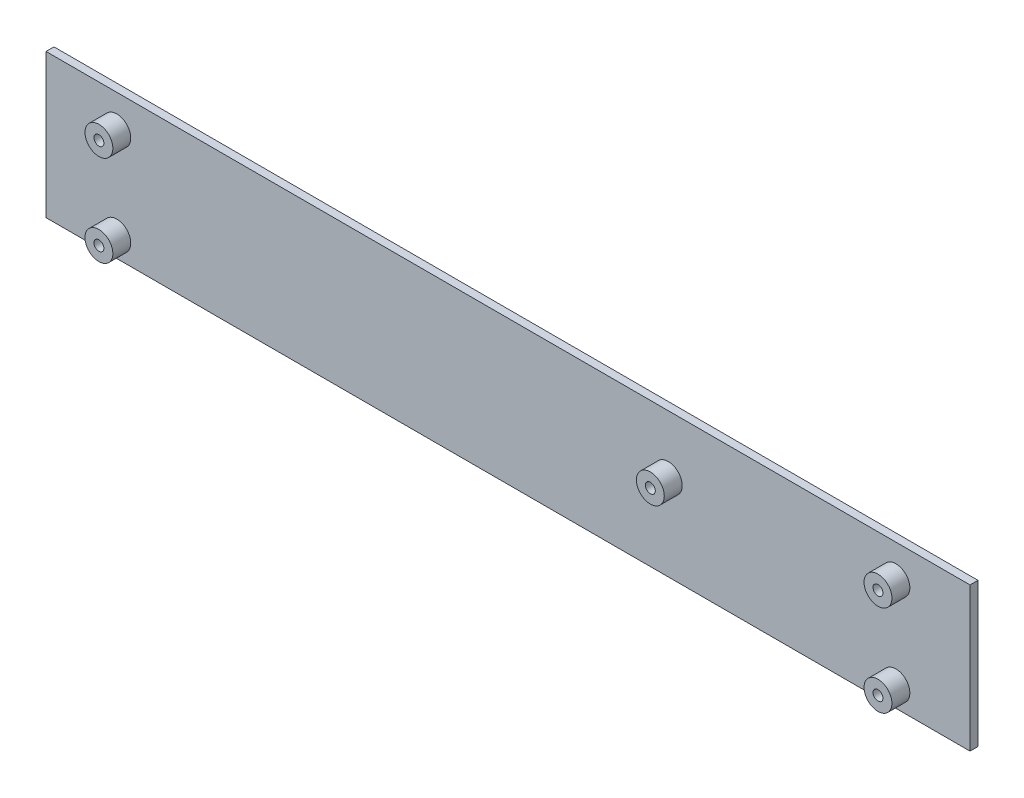
ISO-10303-21;
HEADER;
FILE_DESCRIPTION(('STEP AP214'),'2;1');
FILE_NAME('part.step','',(''),(''),'','','');
FILE_SCHEMA(('AUTOMOTIVE_DESIGN { 1 0 10303 214 1 1 1 1 }'));
ENDSEC;
DATA;
#1=APPLICATION_CONTEXT('core data for automotive mechanical design processes');
#2=APPLICATION_PROTOCOL_DEFINITION('international standard','automotive_design',2000,#1);
#3=PRODUCT_CONTEXT('',#1,'mechanical');
#4=PRODUCT('Part','Part','',(#3));
#5=PRODUCT_RELATED_PRODUCT_CATEGORY('part','',(#4));
#6=PRODUCT_DEFINITION_FORMATION('','',#4);
#7=PRODUCT_DEFINITION_CONTEXT('part definition',#1,'design');
#8=PRODUCT_DEFINITION('design','',#6,#7);
#9=PRODUCT_DEFINITION_SHAPE('','',#8);
#10=(LENGTH_UNIT() NAMED_UNIT(*) SI_UNIT(.MILLI.,.METRE.));
#11=(NAMED_UNIT(*) PLANE_ANGLE_UNIT() SI_UNIT($,.RADIAN.));
#12=(NAMED_UNIT(*) SI_UNIT($,.STERADIAN.) SOLID_ANGLE_UNIT());
#13=UNCERTAINTY_MEASURE_WITH_UNIT(LENGTH_MEASURE(1.E-05),#10,'distance_accuracy_value','');
#14=(GEOMETRIC_REPRESENTATION_CONTEXT(3) GLOBAL_UNCERTAINTY_ASSIGNED_CONTEXT((#13)) GLOBAL_UNIT_ASSIGNED_CONTEXT((#10,
#11,#12)) REPRESENTATION_CONTEXT('',''));
#15=CARTESIAN_POINT('',(0.,0.,0.));
#16=DIRECTION('',(0.,0.,1.));
#17=DIRECTION('',(1.,0.,0.));
#18=AXIS2_PLACEMENT_3D('',#15,#16,#17);
#19=CARTESIAN_POINT('',(58.42,-73.66,-8.09999999999999));
#20=DIRECTION('',(1.,0.,0.));
#21=DIRECTION('',(0.,1.,0.));
#22=AXIS2_PLACEMENT_3D('',#19,#20,#21);
#23=PLANE('',#22);
#24=DIRECTION('',(0.,1.,0.));
#25=VECTOR('',#24,1.);
#26=CARTESIAN_POINT('',(58.42,-73.66,-6.09999999999999));
#27=LINE('',#26,#25);
#28=CARTESIAN_POINT('',(58.42,-73.66,-6.09999999999999));
#29=VERTEX_POINT('',#28);
#30=CARTESIAN_POINT('',(58.42,-37.52,-6.09999999999999));
#31=VERTEX_POINT('',#30);
#32=EDGE_CURVE('E100',#29,#31,#27,.T.);
#33=ORIENTED_EDGE('',*,*,#32,.T.);
#34=DIRECTION('',(0.,0.,1.));
#35=VECTOR('',#34,1.);
#36=CARTESIAN_POINT('',(58.42,-37.52,-8.09999999999999));
#37=LINE('',#36,#35);
#38=CARTESIAN_POINT('',(58.42,-37.52,-8.09999999999999));
#39=VERTEX_POINT('',#38);
#40=EDGE_CURVE('E91',#39,#31,#37,.T.);
#41=ORIENTED_EDGE('',*,*,#40,.F.);
#42=DIRECTION('',(0.,1.,0.));
#43=VECTOR('',#42,1.);
#44=CARTESIAN_POINT('',(58.42,-73.66,-8.09999999999999));
#45=LINE('',#44,#43);
#46=CARTESIAN_POINT('',(58.42,-73.66,-8.09999999999999));
#47=VERTEX_POINT('',#46);
#48=EDGE_CURVE('E85',#47,#39,#45,.T.);
#49=ORIENTED_EDGE('',*,*,#48,.F.);
#50=DIRECTION('',(0.,0.,1.));
#51=VECTOR('',#50,1.);
#52=CARTESIAN_POINT('',(58.42,-73.66,-8.09999999999999));
#53=LINE('',#52,#51);
#54=EDGE_CURVE('E96',#47,#29,#53,.T.);
#55=ORIENTED_EDGE('',*,*,#54,.T.);
#56=EDGE_LOOP('',(#33,#41,#49,#55));
#57=FACE_BOUND('',#56,.T.);
#58=ADVANCED_FACE('F33',(#57),#23,.F.);
#59=CARTESIAN_POINT('',(58.42,-37.52,-8.09999999999999));
#60=DIRECTION('',(0.,-1.,0.));
#61=DIRECTION('',(0.,0.,-1.));
#62=AXIS2_PLACEMENT_3D('',#59,#60,#61);
#63=PLANE('',#62);
#64=DIRECTION('',(1.,0.,0.));
#65=VECTOR('',#64,1.);
#66=CARTESIAN_POINT('',(58.42,-37.52,-6.09999999999999));
#67=LINE('',#66,#65);
#68=CARTESIAN_POINT('',(290.386777063901,-37.52,-6.09999999999999));
#69=VERTEX_POINT('',#68);
#70=EDGE_CURVE('E90',#31,#69,#67,.T.);
#71=ORIENTED_EDGE('',*,*,#70,.T.);
#72=DIRECTION('',(0.,0.,1.));
#73=VECTOR('',#72,1.);
#74=CARTESIAN_POINT('',(290.386777063901,-37.52,-8.09999999999999));
#75=LINE('',#74,#73);
#76=CARTESIAN_POINT('',(290.386777063901,-37.52,-8.09999999999999));
#77=VERTEX_POINT('',#76);
#78=EDGE_CURVE('E88',#77,#69,#75,.T.);
#79=ORIENTED_EDGE('',*,*,#78,.F.);
#80=DIRECTION('',(1.,0.,0.));
#81=VECTOR('',#80,1.);
#82=CARTESIAN_POINT('',(58.42,-37.52,-8.09999999999999));
#83=LINE('',#82,#81);
#84=EDGE_CURVE('E80',#39,#77,#83,.T.);
#85=ORIENTED_EDGE('',*,*,#84,.F.);
#86=ORIENTED_EDGE('',*,*,#40,.T.);
#87=EDGE_LOOP('',(#71,#79,#85,#86));
#88=FACE_BOUND('',#87,.T.);
#89=ADVANCED_FACE('F89',(#88),#63,.F.);
#90=CARTESIAN_POINT('',(290.386777063901,-73.66,-8.09999999999999));
#91=DIRECTION('',(-1.,0.,0.));
#92=DIRECTION('',(0.,0.,1.));
#93=AXIS2_PLACEMENT_3D('',#90,#91,#92);
#94=PLANE('',#93);
#95=DIRECTION('',(0.,-1.,0.));
#96=VECTOR('',#95,1.);
#97=CARTESIAN_POINT('',(290.386777063901,-73.66,-6.09999999999999));
#98=LINE('',#97,#96);
#99=CARTESIAN_POINT('',(290.386777063901,-73.66,-6.09999999999999));
#100=VERTEX_POINT('',#99);
#101=EDGE_CURVE('E66',#69,#100,#98,.T.);
#102=ORIENTED_EDGE('',*,*,#101,.T.);
#103=DIRECTION('',(0.,0.,1.));
#104=VECTOR('',#103,1.);
#105=CARTESIAN_POINT('',(290.386777063901,-73.66,-8.09999999999999));
#106=LINE('',#105,#104);
#107=CARTESIAN_POINT('',(290.386777063901,-73.66,-8.09999999999999));
#108=VERTEX_POINT('',#107);
#109=EDGE_CURVE('E92',#108,#100,#106,.T.);
#110=ORIENTED_EDGE('',*,*,#109,.F.);
#111=DIRECTION('',(0.,-1.,0.));
#112=VECTOR('',#111,1.);
#113=CARTESIAN_POINT('',(290.386777063901,-73.66,-8.09999999999999));
#114=LINE('',#113,#112);
#115=EDGE_CURVE('E83',#77,#108,#114,.T.);
#116=ORIENTED_EDGE('',*,*,#115,.F.);
#117=ORIENTED_EDGE('',*,*,#78,.T.);
#118=EDGE_LOOP('',(#102,#110,#116,#117));
#119=FACE_BOUND('',#118,.T.);
#120=ADVANCED_FACE('F94',(#119),#94,.F.);
#121=CARTESIAN_POINT('',(58.42,-73.66,-8.09999999999999));
#122=DIRECTION('',(0.,1.,0.));
#123=DIRECTION('',(0.,0.,1.));
#124=AXIS2_PLACEMENT_3D('',#121,#122,#123);
#125=PLANE('',#124);
#126=DIRECTION('',(-1.,0.,0.));
#127=VECTOR('',#126,1.);
#128=CARTESIAN_POINT('',(58.42,-73.66,-6.09999999999999));
#129=LINE('',#128,#127);
#130=EDGE_CURVE('E72',#100,#29,#129,.T.);
#131=ORIENTED_EDGE('',*,*,#130,.T.);
#132=ORIENTED_EDGE('',*,*,#54,.F.);
#133=DIRECTION('',(-1.,0.,0.));
#134=VECTOR('',#133,1.);
#135=CARTESIAN_POINT('',(58.42,-73.66,-8.09999999999999));
#136=LINE('',#135,#134);
#137=EDGE_CURVE('E49',#108,#47,#136,.T.);
#138=ORIENTED_EDGE('',*,*,#137,.F.);
#139=ORIENTED_EDGE('',*,*,#109,.T.);
#140=EDGE_LOOP('',(#131,#132,#138,#139));
#141=FACE_BOUND('',#140,.T.);
#142=ADVANCED_FACE('F138',(#141),#125,.F.);
#143=CARTESIAN_POINT('',(0.,0.,-8.09999999999999));
#144=DIRECTION('',(0.,0.,-1.));
#145=DIRECTION('',(-1.,0.,0.));
#146=AXIS2_PLACEMENT_3D('',#143,#144,#145);
#147=PLANE('',#146);
#148=CARTESIAN_POINT('',(271.78,-45.72,-8.09999999999999));
#149=DIRECTION('',(0.,0.,1.));
#150=DIRECTION('',(1.,0.,0.));
#151=AXIS2_PLACEMENT_3D('',#148,#149,#150);
#152=CIRCLE('',#151,1.24999999999997);
#153=CARTESIAN_POINT('',(273.03,-45.72,-8.09999999999999));
#154=VERTEX_POINT('',#153);
#155=EDGE_CURVE('E328',#154,#154,#152,.T.);
#156=ORIENTED_EDGE('',*,*,#155,.T.);
#157=EDGE_LOOP('',(#156));
#158=FACE_BOUND('',#157,.T.);
#159=CARTESIAN_POINT('',(271.78,-68.58,-8.09999999999999));
#160=DIRECTION('',(0.,0.,1.));
#161=DIRECTION('',(1.,0.,0.));
#162=AXIS2_PLACEMENT_3D('',#159,#160,#161);
#163=CIRCLE('',#162,1.24999999999997);
#164=CARTESIAN_POINT('',(273.03,-68.58,-8.09999999999999));
#165=VERTEX_POINT('',#164);
#166=EDGE_CURVE('E338',#165,#165,#163,.T.);
#167=ORIENTED_EDGE('',*,*,#166,.T.);
#168=EDGE_LOOP('',(#167));
#169=FACE_BOUND('',#168,.T.);
#170=CARTESIAN_POINT('',(214.63,-52.07,-8.09999999999999));
#171=DIRECTION('',(0.,0.,1.));
#172=DIRECTION('',(1.,0.,0.));
#173=AXIS2_PLACEMENT_3D('',#170,#171,#172);
#174=CIRCLE('',#173,1.25);
#175=CARTESIAN_POINT('',(215.88,-52.07,-8.09999999999999));
#176=VERTEX_POINT('',#175);
#177=EDGE_CURVE('E344',#176,#176,#174,.T.);
#178=ORIENTED_EDGE('',*,*,#177,.T.);
#179=EDGE_LOOP('',(#178));
#180=FACE_BOUND('',#179,.T.);
#181=CARTESIAN_POINT('',(76.2,-45.72,-8.09999999999999));
#182=DIRECTION('',(0.,0.,1.));
#183=DIRECTION('',(1.,0.,0.));
#184=AXIS2_PLACEMENT_3D('',#181,#182,#183);
#185=CIRCLE('',#184,1.25);
#186=CARTESIAN_POINT('',(77.45,-45.72,-8.09999999999999));
#187=VERTEX_POINT('',#186);
#188=EDGE_CURVE('E350',#187,#187,#185,.T.);
#189=ORIENTED_EDGE('',*,*,#188,.T.);
#190=EDGE_LOOP('',(#189));
#191=FACE_BOUND('',#190,.T.);
#192=CARTESIAN_POINT('',(76.2,-68.58,-8.09999999999999));
#193=DIRECTION('',(0.,0.,1.));
#194=DIRECTION('',(1.,0.,0.));
#195=AXIS2_PLACEMENT_3D('',#192,#193,#194);
#196=CIRCLE('',#195,1.25);
#197=CARTESIAN_POINT('',(77.45,-68.58,-8.09999999999999));
#198=VERTEX_POINT('',#197);
#199=EDGE_CURVE('E356',#198,#198,#196,.T.);
#200=ORIENTED_EDGE('',*,*,#199,.T.);
#201=EDGE_LOOP('',(#200));
#202=FACE_BOUND('',#201,.T.);
#203=ORIENTED_EDGE('',*,*,#48,.T.);
#204=ORIENTED_EDGE('',*,*,#84,.T.);
#205=ORIENTED_EDGE('',*,*,#115,.T.);
#206=ORIENTED_EDGE('',*,*,#137,.T.);
#207=EDGE_LOOP('',(#203,#204,#205,#206));
#208=FACE_BOUND('',#207,.T.);
#209=ADVANCED_FACE('F81',(#158,#169,#180,#191,#202,#208),#147,.T.);
#210=CARTESIAN_POINT('',(0.,0.,-6.09999999999999));
#211=DIRECTION('',(0.,0.,-1.));
#212=DIRECTION('',(-1.,0.,0.));
#213=AXIS2_PLACEMENT_3D('',#210,#211,#212);
#214=PLANE('',#213);
#215=CARTESIAN_POINT('',(76.2,-68.58,-6.09999999999999));
#216=DIRECTION('',(0.,0.,-1.));
#217=DIRECTION('',(-1.,0.,0.));
#218=AXIS2_PLACEMENT_3D('',#215,#216,#217);
#219=CIRCLE('',#218,3.50000000000001);
#220=CARTESIAN_POINT('',(72.7,-68.58,-6.09999999999999));
#221=VERTEX_POINT('',#220);
#222=EDGE_CURVE('E11',#221,#221,#219,.F.);
#223=ORIENTED_EDGE('',*,*,#222,.F.);
#224=EDGE_LOOP('',(#223));
#225=FACE_BOUND('',#224,.T.);
#226=CARTESIAN_POINT('',(76.2,-45.72,-6.09999999999999));
#227=DIRECTION('',(0.,0.,-1.));
#228=DIRECTION('',(-1.,0.,0.));
#229=AXIS2_PLACEMENT_3D('',#226,#227,#228);
#230=CIRCLE('',#229,3.50000000000001);
#231=CARTESIAN_POINT('',(72.7,-45.72,-6.09999999999999));
#232=VERTEX_POINT('',#231);
#233=EDGE_CURVE('E41',#232,#232,#230,.F.);
#234=ORIENTED_EDGE('',*,*,#233,.F.);
#235=EDGE_LOOP('',(#234));
#236=FACE_BOUND('',#235,.T.);
#237=CARTESIAN_POINT('',(214.63,-52.07,-6.09999999999999));
#238=DIRECTION('',(0.,0.,-1.));
#239=DIRECTION('',(-1.,0.,0.));
#240=AXIS2_PLACEMENT_3D('',#237,#238,#239);
#241=CIRCLE('',#240,3.49999999999999);
#242=CARTESIAN_POINT('',(211.13,-52.07,-6.09999999999999));
#243=VERTEX_POINT('',#242);
#244=EDGE_CURVE('E116',#243,#243,#241,.F.);
#245=ORIENTED_EDGE('',*,*,#244,.F.);
#246=EDGE_LOOP('',(#245));
#247=FACE_BOUND('',#246,.T.);
#248=CARTESIAN_POINT('',(271.78,-68.58,-6.09999999999999));
#249=DIRECTION('',(0.,0.,-1.));
#250=DIRECTION('',(-1.,0.,0.));
#251=AXIS2_PLACEMENT_3D('',#248,#249,#250);
#252=CIRCLE('',#251,3.50000000000002);
#253=CARTESIAN_POINT('',(268.28,-68.58,-6.09999999999999));
#254=VERTEX_POINT('',#253);
#255=EDGE_CURVE('E113',#254,#254,#252,.F.);
#256=ORIENTED_EDGE('',*,*,#255,.F.);
#257=EDGE_LOOP('',(#256));
#258=FACE_BOUND('',#257,.T.);
#259=CARTESIAN_POINT('',(271.78,-45.72,-6.09999999999999));
#260=DIRECTION('',(0.,0.,-1.));
#261=DIRECTION('',(-1.,0.,0.));
#262=AXIS2_PLACEMENT_3D('',#259,#260,#261);
#263=CIRCLE('',#262,3.50000000000002);
#264=CARTESIAN_POINT('',(268.28,-45.72,-6.09999999999999));
#265=VERTEX_POINT('',#264);
#266=EDGE_CURVE('E110',#265,#265,#263,.F.);
#267=ORIENTED_EDGE('',*,*,#266,.F.);
#268=EDGE_LOOP('',(#267));
#269=FACE_BOUND('',#268,.T.);
#270=ORIENTED_EDGE('',*,*,#32,.F.);
#271=ORIENTED_EDGE('',*,*,#130,.F.);
#272=ORIENTED_EDGE('',*,*,#101,.F.);
#273=ORIENTED_EDGE('',*,*,#70,.F.);
#274=EDGE_LOOP('',(#270,#271,#272,#273));
#275=FACE_BOUND('',#274,.T.);
#276=ADVANCED_FACE('F124',(#225,#236,#247,#258,#269,#275),#214,.F.);
#277=CARTESIAN_POINT('',(271.78,-45.72,8.29949493661171));
#278=DIRECTION('',(0.,0.,-1.));
#279=DIRECTION('',(-1.,0.,0.));
#280=AXIS2_PLACEMENT_3D('',#277,#278,#279);
#281=CYLINDRICAL_SURFACE('',#280,3.50000000000002);
#282=ORIENTED_EDGE('',*,*,#266,.T.);
#283=EDGE_LOOP('',(#282));
#284=FACE_BOUND('',#283,.T.);
#285=CARTESIAN_POINT('',(271.78,-45.72,-1.59999999999999));
#286=DIRECTION('',(0.,0.,1.));
#287=DIRECTION('',(1.,0.,0.));
#288=AXIS2_PLACEMENT_3D('',#285,#286,#287);
#289=CIRCLE('',#288,3.50000000000002);
#290=CARTESIAN_POINT('',(275.28,-45.72,-1.59999999999999));
#291=VERTEX_POINT('',#290);
#292=EDGE_CURVE('E103',#291,#291,#289,.T.);
#293=ORIENTED_EDGE('',*,*,#292,.F.);
#294=EDGE_LOOP('',(#293));
#295=FACE_BOUND('',#294,.T.);
#296=ADVANCED_FACE('F127',(#284,#295),#281,.T.);
#297=CARTESIAN_POINT('',(173.99,-57.15,-1.59999999999999));
#298=DIRECTION('',(0.,0.,1.));
#299=DIRECTION('',(1.,0.,0.));
#300=AXIS2_PLACEMENT_3D('',#297,#298,#299);
#301=PLANE('',#300);
#302=CARTESIAN_POINT('',(271.78,-45.72,-1.59999999999999));
#303=DIRECTION('',(0.,0.,1.));
#304=DIRECTION('',(1.,0.,0.));
#305=AXIS2_PLACEMENT_3D('',#302,#303,#304);
#306=CIRCLE('',#305,1.24999999999997);
#307=CARTESIAN_POINT('',(273.03,-45.72,-1.59999999999999));
#308=VERTEX_POINT('',#307);
#309=EDGE_CURVE('E331',#308,#308,#306,.T.);
#310=ORIENTED_EDGE('',*,*,#309,.F.);
#311=EDGE_LOOP('',(#310));
#312=FACE_BOUND('',#311,.T.);
#313=ORIENTED_EDGE('',*,*,#292,.T.);
#314=EDGE_LOOP('',(#313));
#315=FACE_BOUND('',#314,.T.);
#316=ADVANCED_FACE('F178',(#312,#315),#301,.T.);
#317=CARTESIAN_POINT('',(271.78,-68.58,8.29949493661171));
#318=DIRECTION('',(0.,0.,-1.));
#319=DIRECTION('',(-1.,0.,0.));
#320=AXIS2_PLACEMENT_3D('',#317,#318,#319);
#321=CYLINDRICAL_SURFACE('',#320,3.50000000000002);
#322=ORIENTED_EDGE('',*,*,#255,.T.);
#323=EDGE_LOOP('',(#322));
#324=FACE_BOUND('',#323,.T.);
#325=CARTESIAN_POINT('',(271.78,-68.58,-1.59999999999999));
#326=DIRECTION('',(0.,0.,1.));
#327=DIRECTION('',(1.,0.,0.));
#328=AXIS2_PLACEMENT_3D('',#325,#326,#327);
#329=CIRCLE('',#328,3.50000000000002);
#330=CARTESIAN_POINT('',(275.28,-68.58,-1.59999999999999));
#331=VERTEX_POINT('',#330);
#332=EDGE_CURVE('E368',#331,#331,#329,.T.);
#333=ORIENTED_EDGE('',*,*,#332,.F.);
#334=EDGE_LOOP('',(#333));
#335=FACE_BOUND('',#334,.T.);
#336=ADVANCED_FACE('F186',(#324,#335),#321,.T.);
#337=CARTESIAN_POINT('',(173.99,-57.15,-1.59999999999999));
#338=DIRECTION('',(0.,0.,1.));
#339=DIRECTION('',(1.,0.,0.));
#340=AXIS2_PLACEMENT_3D('',#337,#338,#339);
#341=PLANE('',#340);
#342=CARTESIAN_POINT('',(271.78,-68.58,-1.59999999999999));
#343=DIRECTION('',(0.,0.,1.));
#344=DIRECTION('',(1.,0.,0.));
#345=AXIS2_PLACEMENT_3D('',#342,#343,#344);
#346=CIRCLE('',#345,1.24999999999997);
#347=CARTESIAN_POINT('',(273.03,-68.58,-1.59999999999999));
#348=VERTEX_POINT('',#347);
#349=EDGE_CURVE('E333',#348,#348,#346,.T.);
#350=ORIENTED_EDGE('',*,*,#349,.F.);
#351=EDGE_LOOP('',(#350));
#352=FACE_BOUND('',#351,.T.);
#353=ORIENTED_EDGE('',*,*,#332,.T.);
#354=EDGE_LOOP('',(#353));
#355=FACE_BOUND('',#354,.T.);
#356=ADVANCED_FACE('F191',(#352,#355),#341,.T.);
#357=CARTESIAN_POINT('',(214.63,-52.07,8.29949493661171));
#358=DIRECTION('',(0.,0.,-1.));
#359=DIRECTION('',(-1.,0.,0.));
#360=AXIS2_PLACEMENT_3D('',#357,#358,#359);
#361=CYLINDRICAL_SURFACE('',#360,3.49999999999999);
#362=ORIENTED_EDGE('',*,*,#244,.T.);
#363=EDGE_LOOP('',(#362));
#364=FACE_BOUND('',#363,.T.);
#365=CARTESIAN_POINT('',(214.63,-52.07,-1.59999999999999));
#366=DIRECTION('',(0.,0.,1.));
#367=DIRECTION('',(1.,0.,0.));
#368=AXIS2_PLACEMENT_3D('',#365,#366,#367);
#369=CIRCLE('',#368,3.49999999999999);
#370=CARTESIAN_POINT('',(218.13,-52.07,-1.59999999999999));
#371=VERTEX_POINT('',#370);
#372=EDGE_CURVE('E365',#371,#371,#369,.T.);
#373=ORIENTED_EDGE('',*,*,#372,.F.);
#374=EDGE_LOOP('',(#373));
#375=FACE_BOUND('',#374,.T.);
#376=ADVANCED_FACE('F199',(#364,#375),#361,.T.);
#377=CARTESIAN_POINT('',(173.99,-57.15,-1.59999999999999));
#378=DIRECTION('',(0.,0.,1.));
#379=DIRECTION('',(1.,0.,0.));
#380=AXIS2_PLACEMENT_3D('',#377,#378,#379);
#381=PLANE('',#380);
#382=CARTESIAN_POINT('',(214.63,-52.07,-1.59999999999999));
#383=DIRECTION('',(0.,0.,1.));
#384=DIRECTION('',(1.,0.,0.));
#385=AXIS2_PLACEMENT_3D('',#382,#383,#384);
#386=CIRCLE('',#385,1.25);
#387=CARTESIAN_POINT('',(215.88,-52.07,-1.59999999999999));
#388=VERTEX_POINT('',#387);
#389=EDGE_CURVE('E341',#388,#388,#386,.T.);
#390=ORIENTED_EDGE('',*,*,#389,.F.);
#391=EDGE_LOOP('',(#390));
#392=FACE_BOUND('',#391,.T.);
#393=ORIENTED_EDGE('',*,*,#372,.T.);
#394=EDGE_LOOP('',(#393));
#395=FACE_BOUND('',#394,.T.);
#396=ADVANCED_FACE('F204',(#392,#395),#381,.T.);
#397=CARTESIAN_POINT('',(76.2,-45.72,8.29949493661171));
#398=DIRECTION('',(0.,0.,-1.));
#399=DIRECTION('',(-1.,0.,0.));
#400=AXIS2_PLACEMENT_3D('',#397,#398,#399);
#401=CYLINDRICAL_SURFACE('',#400,3.50000000000001);
#402=ORIENTED_EDGE('',*,*,#233,.T.);
#403=EDGE_LOOP('',(#402));
#404=FACE_BOUND('',#403,.T.);
#405=CARTESIAN_POINT('',(76.2,-45.72,-1.59999999999999));
#406=DIRECTION('',(0.,0.,1.));
#407=DIRECTION('',(1.,0.,0.));
#408=AXIS2_PLACEMENT_3D('',#405,#406,#407);
#409=CIRCLE('',#408,3.50000000000001);
#410=CARTESIAN_POINT('',(79.7,-45.72,-1.59999999999999));
#411=VERTEX_POINT('',#410);
#412=EDGE_CURVE('E362',#411,#411,#409,.T.);
#413=ORIENTED_EDGE('',*,*,#412,.F.);
#414=EDGE_LOOP('',(#413));
#415=FACE_BOUND('',#414,.T.);
#416=ADVANCED_FACE('F121',(#404,#415),#401,.T.);
#417=CARTESIAN_POINT('',(173.99,-57.15,-1.59999999999999));
#418=DIRECTION('',(0.,0.,1.));
#419=DIRECTION('',(1.,0.,0.));
#420=AXIS2_PLACEMENT_3D('',#417,#418,#419);
#421=PLANE('',#420);
#422=CARTESIAN_POINT('',(76.2,-45.72,-1.59999999999999));
#423=DIRECTION('',(0.,0.,1.));
#424=DIRECTION('',(1.,0.,0.));
#425=AXIS2_PLACEMENT_3D('',#422,#423,#424);
#426=CIRCLE('',#425,1.25);
#427=CARTESIAN_POINT('',(77.45,-45.72,-1.59999999999999));
#428=VERTEX_POINT('',#427);
#429=EDGE_CURVE('E347',#428,#428,#426,.T.);
#430=ORIENTED_EDGE('',*,*,#429,.F.);
#431=EDGE_LOOP('',(#430));
#432=FACE_BOUND('',#431,.T.);
#433=ORIENTED_EDGE('',*,*,#412,.T.);
#434=EDGE_LOOP('',(#433));
#435=FACE_BOUND('',#434,.T.);
#436=ADVANCED_FACE('F216',(#432,#435),#421,.T.);
#437=CARTESIAN_POINT('',(76.2,-68.58,8.29949493661171));
#438=DIRECTION('',(0.,0.,-1.));
#439=DIRECTION('',(-1.,0.,0.));
#440=AXIS2_PLACEMENT_3D('',#437,#438,#439);
#441=CYLINDRICAL_SURFACE('',#440,3.50000000000001);
#442=ORIENTED_EDGE('',*,*,#222,.T.);
#443=EDGE_LOOP('',(#442));
#444=FACE_BOUND('',#443,.T.);
#445=CARTESIAN_POINT('',(76.2,-68.58,-1.59999999999999));
#446=DIRECTION('',(0.,0.,1.));
#447=DIRECTION('',(1.,0.,0.));
#448=AXIS2_PLACEMENT_3D('',#445,#446,#447);
#449=CIRCLE('',#448,3.50000000000001);
#450=CARTESIAN_POINT('',(79.7,-68.58,-1.59999999999999));
#451=VERTEX_POINT('',#450);
#452=EDGE_CURVE('E359',#451,#451,#449,.T.);
#453=ORIENTED_EDGE('',*,*,#452,.F.);
#454=EDGE_LOOP('',(#453));
#455=FACE_BOUND('',#454,.T.);
#456=ADVANCED_FACE('F223',(#444,#455),#441,.T.);
#457=CARTESIAN_POINT('',(173.99,-57.15,-1.59999999999999));
#458=DIRECTION('',(0.,0.,1.));
#459=DIRECTION('',(1.,0.,0.));
#460=AXIS2_PLACEMENT_3D('',#457,#458,#459);
#461=PLANE('',#460);
#462=CARTESIAN_POINT('',(76.2,-68.58,-1.59999999999999));
#463=DIRECTION('',(0.,0.,1.));
#464=DIRECTION('',(1.,0.,0.));
#465=AXIS2_PLACEMENT_3D('',#462,#463,#464);
#466=CIRCLE('',#465,1.25);
#467=CARTESIAN_POINT('',(77.45,-68.58,-1.59999999999999));
#468=VERTEX_POINT('',#467);
#469=EDGE_CURVE('E353',#468,#468,#466,.T.);
#470=ORIENTED_EDGE('',*,*,#469,.F.);
#471=EDGE_LOOP('',(#470));
#472=FACE_BOUND('',#471,.T.);
#473=ORIENTED_EDGE('',*,*,#452,.T.);
#474=EDGE_LOOP('',(#473));
#475=FACE_BOUND('',#474,.T.);
#476=ADVANCED_FACE('F228',(#472,#475),#461,.T.);
#477=CARTESIAN_POINT('',(76.2,-68.58,-1.59999999999999));
#478=DIRECTION('',(0.,0.,1.));
#479=DIRECTION('',(1.,0.,0.));
#480=AXIS2_PLACEMENT_3D('',#477,#478,#479);
#481=CYLINDRICAL_SURFACE('',#480,1.25);
#482=ORIENTED_EDGE('',*,*,#199,.F.);
#483=EDGE_LOOP('',(#482));
#484=FACE_BOUND('',#483,.T.);
#485=ORIENTED_EDGE('',*,*,#469,.T.);
#486=EDGE_LOOP('',(#485));
#487=FACE_BOUND('',#486,.T.);
#488=ADVANCED_FACE('F271',(#484,#487),#481,.F.);
#489=CARTESIAN_POINT('',(76.2,-45.72,-1.59999999999999));
#490=DIRECTION('',(0.,0.,1.));
#491=DIRECTION('',(1.,0.,0.));
#492=AXIS2_PLACEMENT_3D('',#489,#490,#491);
#493=CYLINDRICAL_SURFACE('',#492,1.25);
#494=ORIENTED_EDGE('',*,*,#188,.F.);
#495=EDGE_LOOP('',(#494));
#496=FACE_BOUND('',#495,.T.);
#497=ORIENTED_EDGE('',*,*,#429,.T.);
#498=EDGE_LOOP('',(#497));
#499=FACE_BOUND('',#498,.T.);
#500=ADVANCED_FACE('F281',(#496,#499),#493,.F.);
#501=CARTESIAN_POINT('',(214.63,-52.07,-1.59999999999999));
#502=DIRECTION('',(0.,0.,1.));
#503=DIRECTION('',(1.,0.,0.));
#504=AXIS2_PLACEMENT_3D('',#501,#502,#503);
#505=CYLINDRICAL_SURFACE('',#504,1.25);
#506=ORIENTED_EDGE('',*,*,#177,.F.);
#507=EDGE_LOOP('',(#506));
#508=FACE_BOUND('',#507,.T.);
#509=ORIENTED_EDGE('',*,*,#389,.T.);
#510=EDGE_LOOP('',(#509));
#511=FACE_BOUND('',#510,.T.);
#512=ADVANCED_FACE('F291',(#508,#511),#505,.F.);
#513=CARTESIAN_POINT('',(271.78,-68.58,-1.59999999999999));
#514=DIRECTION('',(0.,0.,1.));
#515=DIRECTION('',(1.,0.,0.));
#516=AXIS2_PLACEMENT_3D('',#513,#514,#515);
#517=CYLINDRICAL_SURFACE('',#516,1.24999999999997);
#518=ORIENTED_EDGE('',*,*,#166,.F.);
#519=EDGE_LOOP('',(#518));
#520=FACE_BOUND('',#519,.T.);
#521=ORIENTED_EDGE('',*,*,#349,.T.);
#522=EDGE_LOOP('',(#521));
#523=FACE_BOUND('',#522,.T.);
#524=ADVANCED_FACE('F301',(#520,#523),#517,.F.);
#525=CARTESIAN_POINT('',(271.78,-45.72,-1.59999999999999));
#526=DIRECTION('',(0.,0.,1.));
#527=DIRECTION('',(1.,0.,0.));
#528=AXIS2_PLACEMENT_3D('',#525,#526,#527);
#529=CYLINDRICAL_SURFACE('',#528,1.24999999999997);
#530=ORIENTED_EDGE('',*,*,#155,.F.);
#531=EDGE_LOOP('',(#530));
#532=FACE_BOUND('',#531,.T.);
#533=ORIENTED_EDGE('',*,*,#309,.T.);
#534=EDGE_LOOP('',(#533));
#535=FACE_BOUND('',#534,.T.);
#536=ADVANCED_FACE('F311',(#532,#535),#529,.F.);
#537=CLOSED_SHELL('',(#58,#89,#120,#142,#209,#276,#296,#316,#336,#356,#376,#396,#416,#436,#456,
#476,#488,#500,#512,#524,#536));
#538=MANIFOLD_SOLID_BREP('B2',#537);
#539=ADVANCED_BREP_SHAPE_REPRESENTATION('',(#18,#538),#14);
#540=SHAPE_DEFINITION_REPRESENTATION(#9,#539);
ENDSEC;
END-ISO-10303-21;
